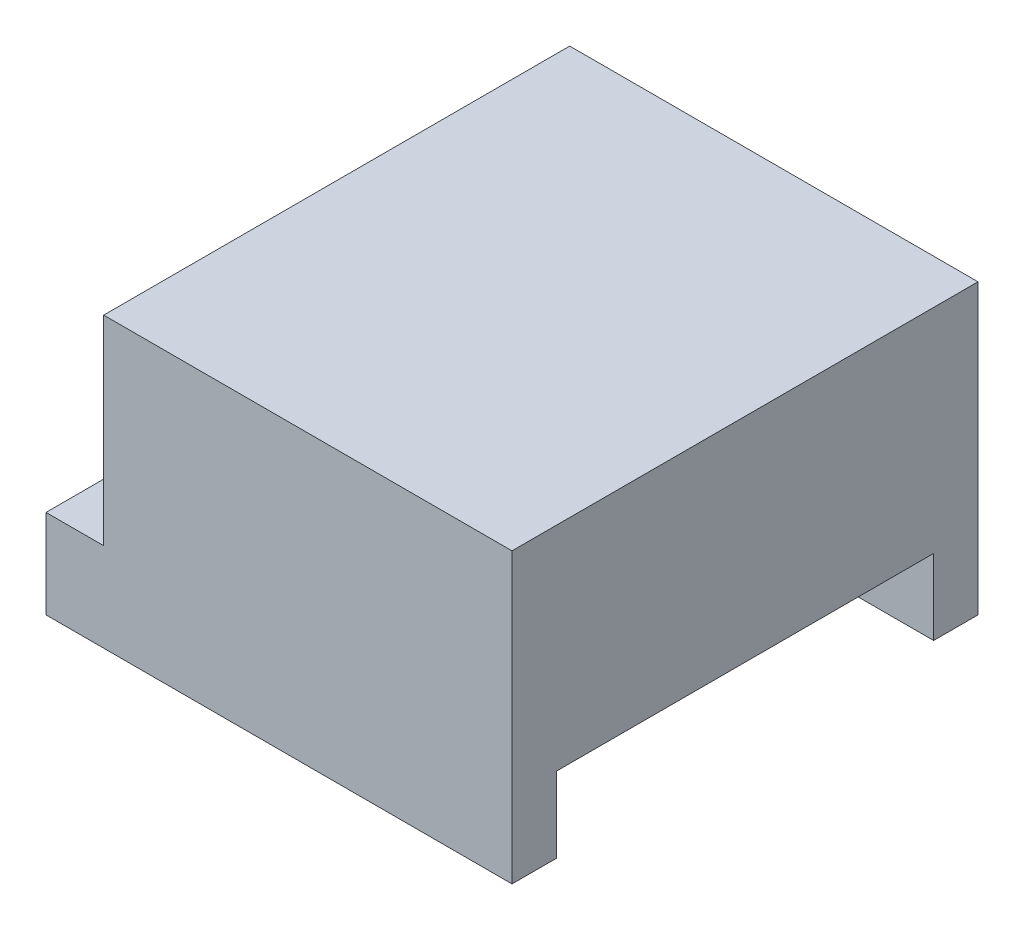
ISO-10303-21;
HEADER;
FILE_DESCRIPTION(('STEP AP214'),'2;1');
FILE_NAME('part.step','',(''),(''),'','','');
FILE_SCHEMA(('AUTOMOTIVE_DESIGN { 1 0 10303 214 1 1 1 1 }'));
ENDSEC;
DATA;
#1=APPLICATION_CONTEXT('core data for automotive mechanical design processes');
#2=APPLICATION_PROTOCOL_DEFINITION('international standard','automotive_design',2000,#1);
#3=PRODUCT_CONTEXT('',#1,'mechanical');
#4=PRODUCT('Part','Part','',(#3));
#5=PRODUCT_RELATED_PRODUCT_CATEGORY('part','',(#4));
#6=PRODUCT_DEFINITION_FORMATION('','',#4);
#7=PRODUCT_DEFINITION_CONTEXT('part definition',#1,'design');
#8=PRODUCT_DEFINITION('design','',#6,#7);
#9=PRODUCT_DEFINITION_SHAPE('','',#8);
#10=(LENGTH_UNIT() NAMED_UNIT(*) SI_UNIT(.MILLI.,.METRE.));
#11=(NAMED_UNIT(*) PLANE_ANGLE_UNIT() SI_UNIT($,.RADIAN.));
#12=(NAMED_UNIT(*) SI_UNIT($,.STERADIAN.) SOLID_ANGLE_UNIT());
#13=UNCERTAINTY_MEASURE_WITH_UNIT(LENGTH_MEASURE(1.E-05),#10,'distance_accuracy_value','');
#14=(GEOMETRIC_REPRESENTATION_CONTEXT(3) GLOBAL_UNCERTAINTY_ASSIGNED_CONTEXT((#13)) GLOBAL_UNIT_ASSIGNED_CONTEXT((#10,
#11,#12)) REPRESENTATION_CONTEXT('',''));
#15=CARTESIAN_POINT('',(0.,0.,0.));
#16=DIRECTION('',(0.,0.,1.));
#17=DIRECTION('',(1.,0.,0.));
#18=AXIS2_PLACEMENT_3D('',#15,#16,#17);
#19=CARTESIAN_POINT('',(46.,45.,-52.5));
#20=DIRECTION('',(-1.,0.,0.));
#21=DIRECTION('',(0.,0.,1.));
#22=AXIS2_PLACEMENT_3D('',#19,#20,#21);
#23=PLANE('',#22);
#24=DIRECTION('',(0.,-1.,0.));
#25=VECTOR('',#24,1.);
#26=CARTESIAN_POINT('',(46.,45.,52.5));
#27=LINE('',#26,#25);
#28=CARTESIAN_POINT('',(46.,45.,52.5));
#29=VERTEX_POINT('',#28);
#30=CARTESIAN_POINT('',(46.,-20.,52.5));
#31=VERTEX_POINT('',#30);
#32=EDGE_CURVE('E193',#29,#31,#27,.T.);
#33=ORIENTED_EDGE('',*,*,#32,.T.);
#34=DIRECTION('',(0.,0.,1.));
#35=VECTOR('',#34,1.);
#36=CARTESIAN_POINT('',(46.,-20.,52.5));
#37=LINE('',#36,#35);
#38=CARTESIAN_POINT('',(46.,-20.,42.5));
#39=VERTEX_POINT('',#38);
#40=EDGE_CURVE('E151',#39,#31,#37,.T.);
#41=ORIENTED_EDGE('',*,*,#40,.F.);
#42=DIRECTION('',(0.,1.,0.));
#43=VECTOR('',#42,1.);
#44=CARTESIAN_POINT('',(46.,-20.,42.5));
#45=LINE('',#44,#43);
#46=CARTESIAN_POINT('',(46.,-3.,42.5));
#47=VERTEX_POINT('',#46);
#48=EDGE_CURVE('E161',#39,#47,#45,.T.);
#49=ORIENTED_EDGE('',*,*,#48,.T.);
#50=DIRECTION('',(0.,0.,1.));
#51=VECTOR('',#50,1.);
#52=CARTESIAN_POINT('',(46.,-3.,-52.5));
#53=LINE('',#52,#51);
#54=CARTESIAN_POINT('',(46.,-3.,-42.5));
#55=VERTEX_POINT('',#54);
#56=EDGE_CURVE('E114',#55,#47,#53,.T.);
#57=ORIENTED_EDGE('',*,*,#56,.F.);
#58=DIRECTION('',(0.,1.,0.));
#59=VECTOR('',#58,1.);
#60=CARTESIAN_POINT('',(46.,-20.,-42.5));
#61=LINE('',#60,#59);
#62=CARTESIAN_POINT('',(46.,-20.,-42.5));
#63=VERTEX_POINT('',#62);
#64=EDGE_CURVE('E108',#63,#55,#61,.T.);
#65=ORIENTED_EDGE('',*,*,#64,.F.);
#66=DIRECTION('',(0.,0.,-1.));
#67=VECTOR('',#66,1.);
#68=CARTESIAN_POINT('',(46.,-20.,-52.5));
#69=LINE('',#68,#67);
#70=CARTESIAN_POINT('',(46.,-20.,-52.5));
#71=VERTEX_POINT('',#70);
#72=EDGE_CURVE('E111',#63,#71,#69,.T.);
#73=ORIENTED_EDGE('',*,*,#72,.T.);
#74=DIRECTION('',(0.,-1.,0.));
#75=VECTOR('',#74,1.);
#76=CARTESIAN_POINT('',(46.,45.,-52.5));
#77=LINE('',#76,#75);
#78=CARTESIAN_POINT('',(46.,45.,-52.5));
#79=VERTEX_POINT('',#78);
#80=EDGE_CURVE('E11',#79,#71,#77,.T.);
#81=ORIENTED_EDGE('',*,*,#80,.F.);
#82=DIRECTION('',(0.,0.,-1.));
#83=VECTOR('',#82,1.);
#84=CARTESIAN_POINT('',(46.,45.,-52.5));
#85=LINE('',#84,#83);
#86=EDGE_CURVE('E184',#29,#79,#85,.T.);
#87=ORIENTED_EDGE('',*,*,#86,.F.);
#88=EDGE_LOOP('',(#33,#41,#49,#57,#65,#73,#81,#87));
#89=FACE_BOUND('',#88,.T.);
#90=ADVANCED_FACE('F34',(#89),#23,.F.);
#91=CARTESIAN_POINT('',(-46.,45.,-52.5));
#92=DIRECTION('',(0.,0.,1.));
#93=DIRECTION('',(1.,0.,0.));
#94=AXIS2_PLACEMENT_3D('',#91,#92,#93);
#95=PLANE('',#94);
#96=ORIENTED_EDGE('',*,*,#80,.T.);
#97=DIRECTION('',(-1.,0.,0.));
#98=VECTOR('',#97,1.);
#99=CARTESIAN_POINT('',(46.,-20.,-52.5));
#100=LINE('',#99,#98);
#101=CARTESIAN_POINT('',(-59.,-20.,-52.5));
#102=VERTEX_POINT('',#101);
#103=EDGE_CURVE('E127',#71,#102,#100,.T.);
#104=ORIENTED_EDGE('',*,*,#103,.T.);
#105=DIRECTION('',(0.,1.,0.));
#106=VECTOR('',#105,1.);
#107=CARTESIAN_POINT('',(-59.,-3.,-52.5));
#108=LINE('',#107,#106);
#109=CARTESIAN_POINT('',(-59.,0.,-52.5));
#110=VERTEX_POINT('',#109);
#111=EDGE_CURVE('E172',#102,#110,#108,.T.);
#112=ORIENTED_EDGE('',*,*,#111,.T.);
#113=DIRECTION('',(1.,0.,0.));
#114=VECTOR('',#113,1.);
#115=CARTESIAN_POINT('',(46.,0.,-52.5));
#116=LINE('',#115,#114);
#117=CARTESIAN_POINT('',(-46.,0.,-52.5));
#118=VERTEX_POINT('',#117);
#119=EDGE_CURVE('E170',#110,#118,#116,.T.);
#120=ORIENTED_EDGE('',*,*,#119,.T.);
#121=DIRECTION('',(0.,-1.,0.));
#122=VECTOR('',#121,1.);
#123=CARTESIAN_POINT('',(-46.,45.,-52.5));
#124=LINE('',#123,#122);
#125=CARTESIAN_POINT('',(-46.,45.,-52.5));
#126=VERTEX_POINT('',#125);
#127=EDGE_CURVE('E41',#126,#118,#124,.T.);
#128=ORIENTED_EDGE('',*,*,#127,.F.);
#129=DIRECTION('',(-1.,0.,0.));
#130=VECTOR('',#129,1.);
#131=CARTESIAN_POINT('',(-46.,45.,-52.5));
#132=LINE('',#131,#130);
#133=EDGE_CURVE('E187',#79,#126,#132,.T.);
#134=ORIENTED_EDGE('',*,*,#133,.F.);
#135=EDGE_LOOP('',(#96,#104,#112,#120,#128,#134));
#136=FACE_BOUND('',#135,.T.);
#137=ADVANCED_FACE('F206',(#136),#95,.F.);
#138=CARTESIAN_POINT('',(-46.,45.,-52.5));
#139=DIRECTION('',(1.,0.,0.));
#140=DIRECTION('',(0.,0.,-1.));
#141=AXIS2_PLACEMENT_3D('',#138,#139,#140);
#142=PLANE('',#141);
#143=DIRECTION('',(0.,0.,1.));
#144=VECTOR('',#143,1.);
#145=CARTESIAN_POINT('',(-46.,0.,-52.5));
#146=LINE('',#145,#144);
#147=CARTESIAN_POINT('',(-46.,0.,52.5));
#148=VERTEX_POINT('',#147);
#149=EDGE_CURVE('E183',#118,#148,#146,.T.);
#150=ORIENTED_EDGE('',*,*,#149,.T.);
#151=DIRECTION('',(0.,-1.,0.));
#152=VECTOR('',#151,1.);
#153=CARTESIAN_POINT('',(-46.,45.,52.5));
#154=LINE('',#153,#152);
#155=CARTESIAN_POINT('',(-46.,45.,52.5));
#156=VERTEX_POINT('',#155);
#157=EDGE_CURVE('E197',#156,#148,#154,.T.);
#158=ORIENTED_EDGE('',*,*,#157,.F.);
#159=DIRECTION('',(0.,0.,1.));
#160=VECTOR('',#159,1.);
#161=CARTESIAN_POINT('',(-46.,45.,-52.5));
#162=LINE('',#161,#160);
#163=EDGE_CURVE('E189',#126,#156,#162,.T.);
#164=ORIENTED_EDGE('',*,*,#163,.F.);
#165=ORIENTED_EDGE('',*,*,#127,.T.);
#166=EDGE_LOOP('',(#150,#158,#164,#165));
#167=FACE_BOUND('',#166,.T.);
#168=ADVANCED_FACE('F203',(#167),#142,.F.);
#169=CARTESIAN_POINT('',(-46.,45.,52.5));
#170=DIRECTION('',(0.,0.,-1.));
#171=DIRECTION('',(-1.,0.,0.));
#172=AXIS2_PLACEMENT_3D('',#169,#170,#171);
#173=PLANE('',#172);
#174=ORIENTED_EDGE('',*,*,#157,.T.);
#175=DIRECTION('',(-1.,0.,0.));
#176=VECTOR('',#175,1.);
#177=CARTESIAN_POINT('',(46.,0.,52.5));
#178=LINE('',#177,#176);
#179=CARTESIAN_POINT('',(-59.,0.,52.5));
#180=VERTEX_POINT('',#179);
#181=EDGE_CURVE('E168',#148,#180,#178,.T.);
#182=ORIENTED_EDGE('',*,*,#181,.T.);
#183=DIRECTION('',(0.,1.,0.));
#184=VECTOR('',#183,1.);
#185=CARTESIAN_POINT('',(-59.,-3.,52.5));
#186=LINE('',#185,#184);
#187=CARTESIAN_POINT('',(-59.,-20.,52.5));
#188=VERTEX_POINT('',#187);
#189=EDGE_CURVE('E180',#188,#180,#186,.T.);
#190=ORIENTED_EDGE('',*,*,#189,.F.);
#191=DIRECTION('',(-1.,0.,0.));
#192=VECTOR('',#191,1.);
#193=CARTESIAN_POINT('',(46.,-20.,52.5));
#194=LINE('',#193,#192);
#195=EDGE_CURVE('E154',#31,#188,#194,.T.);
#196=ORIENTED_EDGE('',*,*,#195,.F.);
#197=ORIENTED_EDGE('',*,*,#32,.F.);
#198=DIRECTION('',(1.,0.,0.));
#199=VECTOR('',#198,1.);
#200=CARTESIAN_POINT('',(-46.,45.,52.5));
#201=LINE('',#200,#199);
#202=EDGE_CURVE('E191',#156,#29,#201,.T.);
#203=ORIENTED_EDGE('',*,*,#202,.F.);
#204=EDGE_LOOP('',(#174,#182,#190,#196,#197,#203));
#205=FACE_BOUND('',#204,.T.);
#206=ADVANCED_FACE('F212',(#205),#173,.F.);
#207=CARTESIAN_POINT('',(0.,45.,0.));
#208=DIRECTION('',(0.,1.,0.));
#209=DIRECTION('',(0.,0.,1.));
#210=AXIS2_PLACEMENT_3D('',#207,#208,#209);
#211=PLANE('',#210);
#212=ORIENTED_EDGE('',*,*,#86,.T.);
#213=ORIENTED_EDGE('',*,*,#133,.T.);
#214=ORIENTED_EDGE('',*,*,#163,.T.);
#215=ORIENTED_EDGE('',*,*,#202,.T.);
#216=EDGE_LOOP('',(#212,#213,#214,#215));
#217=FACE_BOUND('',#216,.T.);
#218=ADVANCED_FACE('F227',(#217),#211,.T.);
#219=CARTESIAN_POINT('',(-59.,-3.,-52.5));
#220=DIRECTION('',(1.,0.,0.));
#221=DIRECTION('',(0.,0.,-1.));
#222=AXIS2_PLACEMENT_3D('',#219,#220,#221);
#223=PLANE('',#222);
#224=DIRECTION('',(0.,0.,-1.));
#225=VECTOR('',#224,1.);
#226=CARTESIAN_POINT('',(-59.,0.,-52.5));
#227=LINE('',#226,#225);
#228=EDGE_CURVE('E174',#180,#110,#227,.T.);
#229=ORIENTED_EDGE('',*,*,#228,.T.);
#230=ORIENTED_EDGE('',*,*,#111,.F.);
#231=DIRECTION('',(0.,0.,1.));
#232=VECTOR('',#231,1.);
#233=CARTESIAN_POINT('',(-59.,-20.,-52.5));
#234=LINE('',#233,#232);
#235=CARTESIAN_POINT('',(-59.,-20.,-42.5));
#236=VERTEX_POINT('',#235);
#237=EDGE_CURVE('E130',#102,#236,#234,.T.);
#238=ORIENTED_EDGE('',*,*,#237,.T.);
#239=DIRECTION('',(0.,1.,0.));
#240=VECTOR('',#239,1.);
#241=CARTESIAN_POINT('',(-59.,-20.,-42.5));
#242=LINE('',#241,#240);
#243=CARTESIAN_POINT('',(-59.,-3.,-42.5));
#244=VERTEX_POINT('',#243);
#245=EDGE_CURVE('E118',#236,#244,#242,.T.);
#246=ORIENTED_EDGE('',*,*,#245,.T.);
#247=DIRECTION('',(0.,0.,-1.));
#248=VECTOR('',#247,1.);
#249=CARTESIAN_POINT('',(-59.,-3.,-52.5));
#250=LINE('',#249,#248);
#251=CARTESIAN_POINT('',(-59.,-3.,42.5));
#252=VERTEX_POINT('',#251);
#253=EDGE_CURVE('E53',#252,#244,#250,.T.);
#254=ORIENTED_EDGE('',*,*,#253,.F.);
#255=DIRECTION('',(0.,1.,0.));
#256=VECTOR('',#255,1.);
#257=CARTESIAN_POINT('',(-59.,-20.,42.5));
#258=LINE('',#257,#256);
#259=CARTESIAN_POINT('',(-59.,-20.,42.5));
#260=VERTEX_POINT('',#259);
#261=EDGE_CURVE('E165',#260,#252,#258,.T.);
#262=ORIENTED_EDGE('',*,*,#261,.F.);
#263=DIRECTION('',(0.,0.,-1.));
#264=VECTOR('',#263,1.);
#265=CARTESIAN_POINT('',(-59.,-20.,52.5));
#266=LINE('',#265,#264);
#267=EDGE_CURVE('E157',#188,#260,#266,.T.);
#268=ORIENTED_EDGE('',*,*,#267,.F.);
#269=ORIENTED_EDGE('',*,*,#189,.T.);
#270=EDGE_LOOP('',(#229,#230,#238,#246,#254,#262,#268,#269));
#271=FACE_BOUND('',#270,.T.);
#272=ADVANCED_FACE('F217',(#271),#223,.F.);
#273=CARTESIAN_POINT('',(0.,-3.,0.));
#274=DIRECTION('',(0.,-1.,0.));
#275=DIRECTION('',(0.,0.,-1.));
#276=AXIS2_PLACEMENT_3D('',#273,#274,#275);
#277=PLANE('',#276);
#278=DIRECTION('',(1.,0.,0.));
#279=VECTOR('',#278,1.);
#280=CARTESIAN_POINT('',(46.,-3.,-42.5));
#281=LINE('',#280,#279);
#282=EDGE_CURVE('E48',#244,#55,#281,.T.);
#283=ORIENTED_EDGE('',*,*,#282,.T.);
#284=ORIENTED_EDGE('',*,*,#56,.T.);
#285=DIRECTION('',(1.,0.,0.));
#286=VECTOR('',#285,1.);
#287=CARTESIAN_POINT('',(46.,-3.,42.5));
#288=LINE('',#287,#286);
#289=EDGE_CURVE('E142',#252,#47,#288,.T.);
#290=ORIENTED_EDGE('',*,*,#289,.F.);
#291=ORIENTED_EDGE('',*,*,#253,.T.);
#292=EDGE_LOOP('',(#283,#284,#290,#291));
#293=FACE_BOUND('',#292,.T.);
#294=ADVANCED_FACE('F234',(#293),#277,.T.);
#295=CARTESIAN_POINT('',(0.,0.,0.));
#296=DIRECTION('',(0.,-1.,0.));
#297=DIRECTION('',(0.,0.,-1.));
#298=AXIS2_PLACEMENT_3D('',#295,#296,#297);
#299=PLANE('',#298);
#300=ORIENTED_EDGE('',*,*,#149,.F.);
#301=ORIENTED_EDGE('',*,*,#119,.F.);
#302=ORIENTED_EDGE('',*,*,#228,.F.);
#303=ORIENTED_EDGE('',*,*,#181,.F.);
#304=EDGE_LOOP('',(#300,#301,#302,#303));
#305=FACE_BOUND('',#304,.T.);
#306=ADVANCED_FACE('F210',(#305),#299,.F.);
#307=CARTESIAN_POINT('',(46.,-20.,42.5));
#308=DIRECTION('',(0.,0.,1.));
#309=DIRECTION('',(1.,0.,0.));
#310=AXIS2_PLACEMENT_3D('',#307,#308,#309);
#311=PLANE('',#310);
#312=ORIENTED_EDGE('',*,*,#289,.T.);
#313=ORIENTED_EDGE('',*,*,#48,.F.);
#314=DIRECTION('',(1.,0.,0.));
#315=VECTOR('',#314,1.);
#316=CARTESIAN_POINT('',(46.,-20.,42.5));
#317=LINE('',#316,#315);
#318=EDGE_CURVE('E159',#260,#39,#317,.T.);
#319=ORIENTED_EDGE('',*,*,#318,.F.);
#320=ORIENTED_EDGE('',*,*,#261,.T.);
#321=EDGE_LOOP('',(#312,#313,#319,#320));
#322=FACE_BOUND('',#321,.T.);
#323=ADVANCED_FACE('F370',(#322),#311,.F.);
#324=CARTESIAN_POINT('',(0.,-20.,0.));
#325=DIRECTION('',(0.,1.,0.));
#326=DIRECTION('',(0.,0.,1.));
#327=AXIS2_PLACEMENT_3D('',#324,#325,#326);
#328=PLANE('',#327);
#329=CARTESIAN_POINT('',(41.5,-20.,47.5));
#330=DIRECTION('',(0.,-1.,0.));
#331=DIRECTION('',(0.,0.,-1.));
#332=AXIS2_PLACEMENT_3D('',#329,#330,#331);
#333=CIRCLE('',#332,1.5);
#334=CARTESIAN_POINT('',(41.5,-20.,46.));
#335=VERTEX_POINT('',#334);
#336=EDGE_CURVE('E143',#335,#335,#333,.T.);
#337=ORIENTED_EDGE('',*,*,#336,.F.);
#338=EDGE_LOOP('',(#337));
#339=FACE_BOUND('',#338,.T.);
#340=CARTESIAN_POINT('',(-38.,-20.,47.5));
#341=DIRECTION('',(0.,-1.,0.));
#342=DIRECTION('',(0.,0.,-1.));
#343=AXIS2_PLACEMENT_3D('',#340,#341,#342);
#344=CIRCLE('',#343,1.5);
#345=CARTESIAN_POINT('',(-38.,-20.,46.));
#346=VERTEX_POINT('',#345);
#347=EDGE_CURVE('E117',#346,#346,#344,.T.);
#348=ORIENTED_EDGE('',*,*,#347,.F.);
#349=EDGE_LOOP('',(#348));
#350=FACE_BOUND('',#349,.T.);
#351=ORIENTED_EDGE('',*,*,#40,.T.);
#352=ORIENTED_EDGE('',*,*,#195,.T.);
#353=ORIENTED_EDGE('',*,*,#267,.T.);
#354=ORIENTED_EDGE('',*,*,#318,.T.);
#355=EDGE_LOOP('',(#351,#352,#353,#354));
#356=FACE_BOUND('',#355,.T.);
#357=ADVANCED_FACE('F221',(#339,#350,#356),#328,.F.);
#358=CARTESIAN_POINT('',(-38.,15.,47.5));
#359=DIRECTION('',(0.,-1.,0.));
#360=DIRECTION('',(0.,0.,-1.));
#361=AXIS2_PLACEMENT_3D('',#358,#359,#360);
#362=CYLINDRICAL_SURFACE('',#361,1.5);
#363=CARTESIAN_POINT('',(-38.,15.,47.5));
#364=DIRECTION('',(0.,-1.,0.));
#365=DIRECTION('',(0.,0.,-1.));
#366=AXIS2_PLACEMENT_3D('',#363,#364,#365);
#367=CIRCLE('',#366,1.5);
#368=CARTESIAN_POINT('',(-38.,15.,46.));
#369=VERTEX_POINT('',#368);
#370=EDGE_CURVE('E146',#369,#369,#367,.T.);
#371=ORIENTED_EDGE('',*,*,#370,.F.);
#372=EDGE_LOOP('',(#371));
#373=FACE_BOUND('',#372,.T.);
#374=ORIENTED_EDGE('',*,*,#347,.T.);
#375=EDGE_LOOP('',(#374));
#376=FACE_BOUND('',#375,.T.);
#377=ADVANCED_FACE('F363',(#373,#376),#362,.F.);
#378=CARTESIAN_POINT('',(-38.,15.,47.5));
#379=DIRECTION('',(0.,-1.,0.));
#380=DIRECTION('',(0.,0.,-1.));
#381=AXIS2_PLACEMENT_3D('',#378,#379,#380);
#382=PLANE('',#381);
#383=ORIENTED_EDGE('',*,*,#370,.T.);
#384=EDGE_LOOP('',(#383));
#385=FACE_BOUND('',#384,.T.);
#386=ADVANCED_FACE('F359',(#385),#382,.T.);
#387=CARTESIAN_POINT('',(41.5,15.,47.5));
#388=DIRECTION('',(0.,-1.,0.));
#389=DIRECTION('',(0.,0.,-1.));
#390=AXIS2_PLACEMENT_3D('',#387,#388,#389);
#391=CYLINDRICAL_SURFACE('',#390,1.5);
#392=CARTESIAN_POINT('',(41.5,15.,47.5));
#393=DIRECTION('',(0.,-1.,0.));
#394=DIRECTION('',(0.,0.,-1.));
#395=AXIS2_PLACEMENT_3D('',#392,#393,#394);
#396=CIRCLE('',#395,1.5);
#397=CARTESIAN_POINT('',(41.5,15.,46.));
#398=VERTEX_POINT('',#397);
#399=EDGE_CURVE('E139',#398,#398,#396,.T.);
#400=ORIENTED_EDGE('',*,*,#399,.F.);
#401=EDGE_LOOP('',(#400));
#402=FACE_BOUND('',#401,.T.);
#403=ORIENTED_EDGE('',*,*,#336,.T.);
#404=EDGE_LOOP('',(#403));
#405=FACE_BOUND('',#404,.T.);
#406=ADVANCED_FACE('F355',(#402,#405),#391,.F.);
#407=CARTESIAN_POINT('',(41.5,15.,47.5));
#408=DIRECTION('',(0.,-1.,0.));
#409=DIRECTION('',(0.,0.,-1.));
#410=AXIS2_PLACEMENT_3D('',#407,#408,#409);
#411=PLANE('',#410);
#412=ORIENTED_EDGE('',*,*,#399,.T.);
#413=EDGE_LOOP('',(#412));
#414=FACE_BOUND('',#413,.T.);
#415=ADVANCED_FACE('F269',(#414),#411,.T.);
#416=CARTESIAN_POINT('',(46.,-20.,-42.5));
#417=DIRECTION('',(0.,0.,1.));
#418=DIRECTION('',(1.,0.,0.));
#419=AXIS2_PLACEMENT_3D('',#416,#417,#418);
#420=PLANE('',#419);
#421=ORIENTED_EDGE('',*,*,#282,.F.);
#422=ORIENTED_EDGE('',*,*,#245,.F.);
#423=DIRECTION('',(1.,0.,0.));
#424=VECTOR('',#423,1.);
#425=CARTESIAN_POINT('',(46.,-20.,-42.5));
#426=LINE('',#425,#424);
#427=EDGE_CURVE('E124',#236,#63,#426,.T.);
#428=ORIENTED_EDGE('',*,*,#427,.T.);
#429=ORIENTED_EDGE('',*,*,#64,.T.);
#430=EDGE_LOOP('',(#421,#422,#428,#429));
#431=FACE_BOUND('',#430,.T.);
#432=ADVANCED_FACE('F129',(#431),#420,.T.);
#433=CARTESIAN_POINT('',(0.,-20.,0.));
#434=DIRECTION('',(0.,1.,0.));
#435=DIRECTION('',(0.,0.,-1.));
#436=AXIS2_PLACEMENT_3D('',#433,#434,#435);
#437=PLANE('',#436);
#438=CARTESIAN_POINT('',(41.5,-20.,-47.5));
#439=DIRECTION('',(0.,1.,0.));
#440=DIRECTION('',(0.,0.,1.));
#441=AXIS2_PLACEMENT_3D('',#438,#439,#440);
#442=CIRCLE('',#441,1.5);
#443=CARTESIAN_POINT('',(41.5,-20.,-46.));
#444=VERTEX_POINT('',#443);
#445=EDGE_CURVE('E455',#444,#444,#442,.T.);
#446=ORIENTED_EDGE('',*,*,#445,.T.);
#447=EDGE_LOOP('',(#446));
#448=FACE_BOUND('',#447,.T.);
#449=CARTESIAN_POINT('',(-38.,-20.,-47.5));
#450=DIRECTION('',(0.,1.,0.));
#451=DIRECTION('',(0.,0.,1.));
#452=AXIS2_PLACEMENT_3D('',#449,#450,#451);
#453=CIRCLE('',#452,1.5);
#454=CARTESIAN_POINT('',(-38.,-20.,-46.));
#455=VERTEX_POINT('',#454);
#456=EDGE_CURVE('E462',#455,#455,#453,.T.);
#457=ORIENTED_EDGE('',*,*,#456,.T.);
#458=EDGE_LOOP('',(#457));
#459=FACE_BOUND('',#458,.T.);
#460=ORIENTED_EDGE('',*,*,#72,.F.);
#461=ORIENTED_EDGE('',*,*,#427,.F.);
#462=ORIENTED_EDGE('',*,*,#237,.F.);
#463=ORIENTED_EDGE('',*,*,#103,.F.);
#464=EDGE_LOOP('',(#460,#461,#462,#463));
#465=FACE_BOUND('',#464,.T.);
#466=ADVANCED_FACE('F122',(#448,#459,#465),#437,.F.);
#467=CARTESIAN_POINT('',(-38.,15.,-47.5));
#468=DIRECTION('',(0.,-1.,0.));
#469=DIRECTION('',(0.,0.,-1.));
#470=AXIS2_PLACEMENT_3D('',#467,#468,#469);
#471=CYLINDRICAL_SURFACE('',#470,1.5);
#472=CARTESIAN_POINT('',(-38.,15.,-47.5));
#473=DIRECTION('',(0.,1.,0.));
#474=DIRECTION('',(0.,0.,1.));
#475=AXIS2_PLACEMENT_3D('',#472,#473,#474);
#476=CIRCLE('',#475,1.5);
#477=CARTESIAN_POINT('',(-38.,15.,-46.));
#478=VERTEX_POINT('',#477);
#479=EDGE_CURVE('E458',#478,#478,#476,.T.);
#480=ORIENTED_EDGE('',*,*,#479,.T.);
#481=EDGE_LOOP('',(#480));
#482=FACE_BOUND('',#481,.T.);
#483=ORIENTED_EDGE('',*,*,#456,.F.);
#484=EDGE_LOOP('',(#483));
#485=FACE_BOUND('',#484,.T.);
#486=ADVANCED_FACE('F308',(#482,#485),#471,.F.);
#487=CARTESIAN_POINT('',(-38.,15.,-47.5));
#488=DIRECTION('',(0.,-1.,0.));
#489=DIRECTION('',(0.,0.,1.));
#490=AXIS2_PLACEMENT_3D('',#487,#488,#489);
#491=PLANE('',#490);
#492=ORIENTED_EDGE('',*,*,#479,.F.);
#493=EDGE_LOOP('',(#492));
#494=FACE_BOUND('',#493,.T.);
#495=ADVANCED_FACE('F318',(#494),#491,.T.);
#496=CARTESIAN_POINT('',(41.5,15.,-47.5));
#497=DIRECTION('',(0.,-1.,0.));
#498=DIRECTION('',(0.,0.,-1.));
#499=AXIS2_PLACEMENT_3D('',#496,#497,#498);
#500=CYLINDRICAL_SURFACE('',#499,1.5);
#501=CARTESIAN_POINT('',(41.5,15.,-47.5));
#502=DIRECTION('',(0.,1.,0.));
#503=DIRECTION('',(0.,0.,1.));
#504=AXIS2_PLACEMENT_3D('',#501,#502,#503);
#505=CIRCLE('',#504,1.5);
#506=CARTESIAN_POINT('',(41.5,15.,-46.));
#507=VERTEX_POINT('',#506);
#508=EDGE_CURVE('E137',#507,#507,#505,.T.);
#509=ORIENTED_EDGE('',*,*,#508,.T.);
#510=EDGE_LOOP('',(#509));
#511=FACE_BOUND('',#510,.T.);
#512=ORIENTED_EDGE('',*,*,#445,.F.);
#513=EDGE_LOOP('',(#512));
#514=FACE_BOUND('',#513,.T.);
#515=ADVANCED_FACE('F328',(#511,#514),#500,.F.);
#516=CARTESIAN_POINT('',(41.5,15.,-47.5));
#517=DIRECTION('',(0.,-1.,0.));
#518=DIRECTION('',(0.,0.,1.));
#519=AXIS2_PLACEMENT_3D('',#516,#517,#518);
#520=PLANE('',#519);
#521=ORIENTED_EDGE('',*,*,#508,.F.);
#522=EDGE_LOOP('',(#521));
#523=FACE_BOUND('',#522,.T.);
#524=ADVANCED_FACE('F338',(#523),#520,.T.);
#525=CLOSED_SHELL('',(#90,#137,#168,#206,#218,#272,#294,#306,#323,#357,#377,#386,#406,#415,#432,
#466,#486,#495,#515,#524));
#526=MANIFOLD_SOLID_BREP('B2',#525);
#527=ADVANCED_BREP_SHAPE_REPRESENTATION('',(#18,#526),#14);
#528=SHAPE_DEFINITION_REPRESENTATION(#9,#527);
ENDSEC;
END-ISO-10303-21;
